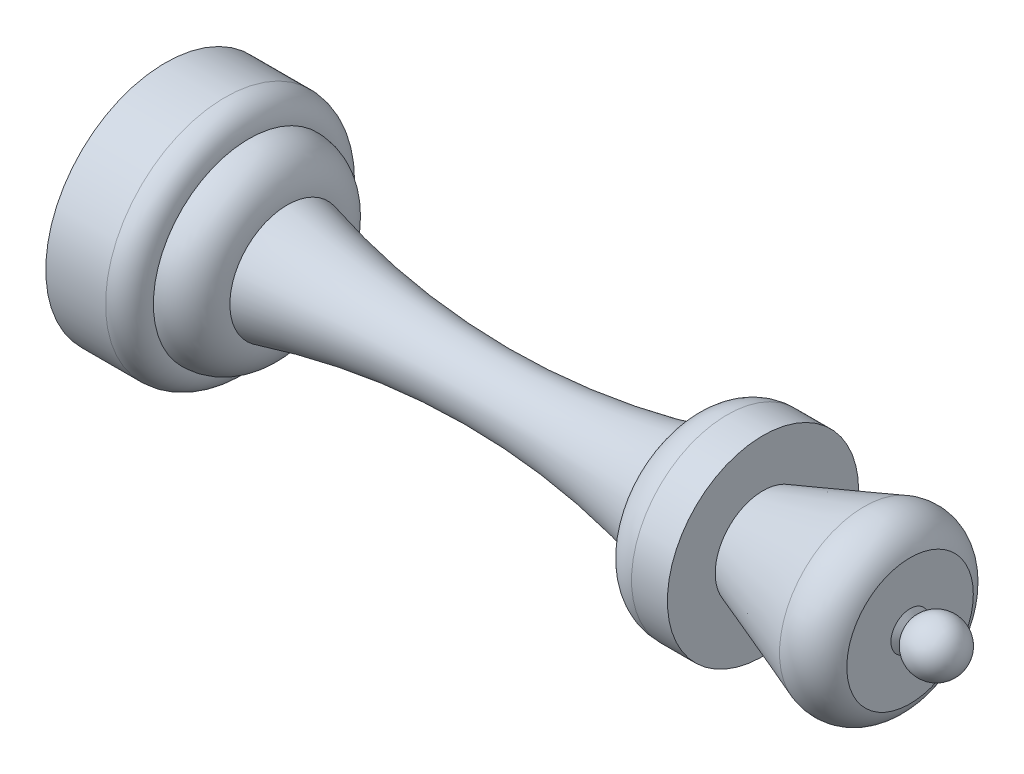
ISO-10303-21;
HEADER;
FILE_DESCRIPTION(('STEP AP214'),'2;1');
FILE_NAME('part.step','',(''),(''),'','','');
FILE_SCHEMA(('AUTOMOTIVE_DESIGN { 1 0 10303 214 1 1 1 1 }'));
ENDSEC;
DATA;
#1=APPLICATION_CONTEXT('core data for automotive mechanical design processes');
#2=APPLICATION_PROTOCOL_DEFINITION('international standard','automotive_design',2000,#1);
#3=PRODUCT_CONTEXT('',#1,'mechanical');
#4=PRODUCT('Part','Part','',(#3));
#5=PRODUCT_RELATED_PRODUCT_CATEGORY('part','',(#4));
#6=PRODUCT_DEFINITION_FORMATION('','',#4);
#7=PRODUCT_DEFINITION_CONTEXT('part definition',#1,'design');
#8=PRODUCT_DEFINITION('design','',#6,#7);
#9=PRODUCT_DEFINITION_SHAPE('','',#8);
#10=(LENGTH_UNIT() NAMED_UNIT(*) SI_UNIT(.MILLI.,.METRE.));
#11=(NAMED_UNIT(*) PLANE_ANGLE_UNIT() SI_UNIT($,.RADIAN.));
#12=(NAMED_UNIT(*) SI_UNIT($,.STERADIAN.) SOLID_ANGLE_UNIT());
#13=UNCERTAINTY_MEASURE_WITH_UNIT(LENGTH_MEASURE(1.E-05),#10,'distance_accuracy_value','');
#14=(GEOMETRIC_REPRESENTATION_CONTEXT(3) GLOBAL_UNCERTAINTY_ASSIGNED_CONTEXT((#13)) GLOBAL_UNIT_ASSIGNED_CONTEXT((#10,
#11,#12)) REPRESENTATION_CONTEXT('',''));
#15=CARTESIAN_POINT('',(0.,0.,0.));
#16=DIRECTION('',(0.,0.,1.));
#17=DIRECTION('',(1.,0.,0.));
#18=AXIS2_PLACEMENT_3D('',#15,#16,#17);
#19=CARTESIAN_POINT('',(7.,0.,0.));
#20=DIRECTION('',(1.,0.,0.));
#21=DIRECTION('',(0.,0.,-1.));
#22=AXIS2_PLACEMENT_3D('',#19,#20,#21);
#23=TOROIDAL_SURFACE('',#22,4.8,3.2);
#24=CARTESIAN_POINT('',(10.2,0.,0.));
#25=DIRECTION('',(1.,0.,0.));
#26=DIRECTION('',(0.,0.,-1.));
#27=AXIS2_PLACEMENT_3D('',#24,#25,#26);
#28=CIRCLE('',#27,4.8);
#29=CARTESIAN_POINT('',(10.2,0.,-4.8));
#30=VERTEX_POINT('',#29);
#31=EDGE_CURVE('E55',#30,#30,#28,.T.);
#32=ORIENTED_EDGE('',*,*,#31,.F.);
#33=EDGE_LOOP('',(#32));
#34=FACE_BOUND('',#33,.T.);
#35=CARTESIAN_POINT('',(7.,0.,0.));
#36=DIRECTION('',(1.,0.,0.));
#37=DIRECTION('',(0.,0.,-1.));
#38=AXIS2_PLACEMENT_3D('',#35,#36,#37);
#39=CIRCLE('',#38,8.);
#40=CARTESIAN_POINT('',(7.,0.,-8.));
#41=VERTEX_POINT('',#40);
#42=EDGE_CURVE('E60',#41,#41,#39,.T.);
#43=ORIENTED_EDGE('',*,*,#42,.T.);
#44=EDGE_LOOP('',(#43));
#45=FACE_BOUND('',#44,.T.);
#46=ADVANCED_FACE('F46',(#34,#45),#23,.T.);
#47=CARTESIAN_POINT('',(5.,0.,0.));
#48=DIRECTION('',(1.,0.,0.));
#49=DIRECTION('',(0.,0.,-1.));
#50=AXIS2_PLACEMENT_3D('',#47,#48,#49);
#51=TOROIDAL_SURFACE('',#50,8.,2.);
#52=ORIENTED_EDGE('',*,*,#42,.F.);
#53=EDGE_LOOP('',(#52));
#54=FACE_BOUND('',#53,.T.);
#55=CARTESIAN_POINT('',(5.,0.,0.));
#56=DIRECTION('',(1.,0.,0.));
#57=DIRECTION('',(0.,0.,-1.));
#58=AXIS2_PLACEMENT_3D('',#55,#56,#57);
#59=CIRCLE('',#58,10.);
#60=CARTESIAN_POINT('',(5.,0.,-10.));
#61=VERTEX_POINT('',#60);
#62=EDGE_CURVE('E65',#61,#61,#59,.T.);
#63=ORIENTED_EDGE('',*,*,#62,.T.);
#64=EDGE_LOOP('',(#63));
#65=FACE_BOUND('',#64,.T.);
#66=ADVANCED_FACE('F156',(#54,#65),#51,.T.);
#67=CARTESIAN_POINT('',(5.,0.,0.));
#68=DIRECTION('',(1.,0.,0.));
#69=DIRECTION('',(0.,0.,-1.));
#70=AXIS2_PLACEMENT_3D('',#67,#68,#69);
#71=CYLINDRICAL_SURFACE('',#70,10.);
#72=ORIENTED_EDGE('',*,*,#62,.F.);
#73=EDGE_LOOP('',(#72));
#74=FACE_BOUND('',#73,.T.);
#75=CARTESIAN_POINT('',(0.,0.,0.));
#76=DIRECTION('',(1.,0.,0.));
#77=DIRECTION('',(0.,0.,-1.));
#78=AXIS2_PLACEMENT_3D('',#75,#76,#77);
#79=CIRCLE('',#78,10.);
#80=CARTESIAN_POINT('',(0.,0.,-10.));
#81=VERTEX_POINT('',#80);
#82=EDGE_CURVE('E71',#81,#81,#79,.T.);
#83=ORIENTED_EDGE('',*,*,#82,.T.);
#84=EDGE_LOOP('',(#83));
#85=FACE_BOUND('',#84,.T.);
#86=ADVANCED_FACE('F162',(#74,#85),#71,.T.);
#87=CARTESIAN_POINT('',(0.,0.,0.));
#88=DIRECTION('',(1.,0.,0.));
#89=DIRECTION('',(0.,0.,-1.));
#90=AXIS2_PLACEMENT_3D('',#87,#88,#89);
#91=PLANE('',#90);
#92=ORIENTED_EDGE('',*,*,#82,.F.);
#93=EDGE_LOOP('',(#92));
#94=FACE_BOUND('',#93,.T.);
#95=ADVANCED_FACE('F118',(#94),#91,.F.);
#96=CARTESIAN_POINT('',(59.4832940170502,0.,0.));
#97=DIRECTION('',(1.,0.,0.));
#98=DIRECTION('',(0.,0.,-1.));
#99=AXIS2_PLACEMENT_3D('',#96,#97,#98);
#100=TOROIDAL_SURFACE('',#99,4.25910342757333,3.);
#101=CARTESIAN_POINT('',(62.3,0.,0.));
#102=DIRECTION('',(1.,0.,0.));
#103=DIRECTION('',(0.,0.,-1.));
#104=AXIS2_PLACEMENT_3D('',#101,#102,#103);
#105=CIRCLE('',#104,5.29165725455507);
#106=CARTESIAN_POINT('',(62.3,0.,-5.29165725455507));
#107=VERTEX_POINT('',#106);
#108=EDGE_CURVE('E107',#107,#107,#105,.T.);
#109=ORIENTED_EDGE('',*,*,#108,.F.);
#110=EDGE_LOOP('',(#109));
#111=FACE_BOUND('',#110,.T.);
#112=CARTESIAN_POINT('',(58.4572335870732,0.,0.));
#113=DIRECTION('',(1.,0.,0.));
#114=DIRECTION('',(0.,0.,-1.));
#115=AXIS2_PLACEMENT_3D('',#112,#113,#114);
#116=CIRCLE('',#115,7.07818128993106);
#117=CARTESIAN_POINT('',(58.4572335870732,0.,-7.07818128993106));
#118=VERTEX_POINT('',#117);
#119=EDGE_CURVE('E79',#118,#118,#116,.T.);
#120=ORIENTED_EDGE('',*,*,#119,.T.);
#121=EDGE_LOOP('',(#120));
#122=FACE_BOUND('',#121,.T.);
#123=ADVANCED_FACE('F114',(#111,#122),#100,.T.);
#124=CARTESIAN_POINT('',(50.,0.,0.));
#125=DIRECTION('',(1.,0.,0.));
#126=DIRECTION('',(0.,0.,-1.));
#127=AXIS2_PLACEMENT_3D('',#124,#125,#126);
#128=CONICAL_SURFACE('',#127,4.,0.34906585039887);
#129=ORIENTED_EDGE('',*,*,#119,.F.);
#130=EDGE_LOOP('',(#129));
#131=FACE_BOUND('',#130,.T.);
#132=CARTESIAN_POINT('',(50.,0.,0.));
#133=DIRECTION('',(1.,0.,0.));
#134=DIRECTION('',(0.,0.,-1.));
#135=AXIS2_PLACEMENT_3D('',#132,#133,#134);
#136=CIRCLE('',#135,4.);
#137=CARTESIAN_POINT('',(50.,0.,-4.));
#138=VERTEX_POINT('',#137);
#139=EDGE_CURVE('E83',#138,#138,#136,.T.);
#140=ORIENTED_EDGE('',*,*,#139,.T.);
#141=EDGE_LOOP('',(#140));
#142=FACE_BOUND('',#141,.T.);
#143=ADVANCED_FACE('F117',(#131,#142),#128,.T.);
#144=CARTESIAN_POINT('',(50.,0.,0.));
#145=DIRECTION('',(-1.,0.,0.));
#146=DIRECTION('',(0.,0.,1.));
#147=AXIS2_PLACEMENT_3D('',#144,#145,#146);
#148=PLANE('',#147);
#149=ORIENTED_EDGE('',*,*,#139,.F.);
#150=EDGE_LOOP('',(#149));
#151=FACE_BOUND('',#150,.T.);
#152=CARTESIAN_POINT('',(50.,0.,0.));
#153=DIRECTION('',(1.,0.,0.));
#154=DIRECTION('',(0.,0.,-1.));
#155=AXIS2_PLACEMENT_3D('',#152,#153,#154);
#156=CIRCLE('',#155,8.);
#157=CARTESIAN_POINT('',(50.,0.,-8.));
#158=VERTEX_POINT('',#157);
#159=EDGE_CURVE('E87',#158,#158,#156,.T.);
#160=ORIENTED_EDGE('',*,*,#159,.T.);
#161=EDGE_LOOP('',(#160));
#162=FACE_BOUND('',#161,.T.);
#163=ADVANCED_FACE('F124',(#151,#162),#148,.F.);
#164=CARTESIAN_POINT('',(50.,0.,0.));
#165=DIRECTION('',(1.,0.,0.));
#166=DIRECTION('',(0.,0.,-1.));
#167=AXIS2_PLACEMENT_3D('',#164,#165,#166);
#168=CYLINDRICAL_SURFACE('',#167,8.);
#169=ORIENTED_EDGE('',*,*,#159,.F.);
#170=EDGE_LOOP('',(#169));
#171=FACE_BOUND('',#170,.T.);
#172=CARTESIAN_POINT('',(47.,0.,0.));
#173=DIRECTION('',(1.,0.,0.));
#174=DIRECTION('',(0.,0.,-1.));
#175=AXIS2_PLACEMENT_3D('',#172,#173,#174);
#176=CIRCLE('',#175,8.);
#177=CARTESIAN_POINT('',(47.,0.,-8.));
#178=VERTEX_POINT('',#177);
#179=EDGE_CURVE('E91',#178,#178,#176,.T.);
#180=ORIENTED_EDGE('',*,*,#179,.T.);
#181=EDGE_LOOP('',(#180));
#182=FACE_BOUND('',#181,.T.);
#183=ADVANCED_FACE('F130',(#171,#182),#168,.T.);
#184=CARTESIAN_POINT('',(47.,0.,0.));
#185=DIRECTION('',(1.,0.,0.));
#186=DIRECTION('',(0.,0.,-1.));
#187=AXIS2_PLACEMENT_3D('',#184,#185,#186);
#188=TOROIDAL_SURFACE('',#187,4.8,3.2);
#189=ORIENTED_EDGE('',*,*,#179,.F.);
#190=EDGE_LOOP('',(#189));
#191=FACE_BOUND('',#190,.T.);
#192=CARTESIAN_POINT('',(43.8,0.,0.));
#193=DIRECTION('',(1.,0.,0.));
#194=DIRECTION('',(0.,0.,-1.));
#195=AXIS2_PLACEMENT_3D('',#192,#193,#194);
#196=CIRCLE('',#195,4.8);
#197=CARTESIAN_POINT('',(43.8,0.,-4.8));
#198=VERTEX_POINT('',#197);
#199=EDGE_CURVE('E95',#198,#198,#196,.T.);
#200=ORIENTED_EDGE('',*,*,#199,.T.);
#201=EDGE_LOOP('',(#200));
#202=FACE_BOUND('',#201,.T.);
#203=ADVANCED_FACE('F136',(#191,#202),#188,.T.);
#204=CARTESIAN_POINT('',(27.,0.,0.));
#205=DIRECTION('',(1.,0.,0.));
#206=DIRECTION('',(0.,0.,-1.));
#207=AXIS2_PLACEMENT_3D('',#204,#205,#206);
#208=TOROIDAL_SURFACE('',#207,67.5914006851257,65.);
#209=ORIENTED_EDGE('',*,*,#199,.F.);
#210=EDGE_LOOP('',(#209));
#211=FACE_BOUND('',#210,.T.);
#212=ORIENTED_EDGE('',*,*,#31,.T.);
#213=EDGE_LOOP('',(#212));
#214=FACE_BOUND('',#213,.T.);
#215=ADVANCED_FACE('F142',(#211,#214),#208,.F.);
#216=CARTESIAN_POINT('',(64.5,0.,0.));
#217=DIRECTION('',(1.,0.,0.));
#218=DIRECTION('',(0.,0.,-1.));
#219=AXIS2_PLACEMENT_3D('',#216,#217,#218);
#220=SPHERICAL_SURFACE('',#219,2.19999999999999);
#221=CARTESIAN_POINT('',(62.5947441116742,0.,0.));
#222=DIRECTION('',(1.,0.,0.));
#223=DIRECTION('',(0.,0.,-1.));
#224=AXIS2_PLACEMENT_3D('',#221,#222,#223);
#225=CIRCLE('',#224,1.09999999999999);
#226=CARTESIAN_POINT('',(62.5947441116742,0.,-1.09999999999999));
#227=VERTEX_POINT('',#226);
#228=EDGE_CURVE('E99',#227,#227,#225,.T.);
#229=ORIENTED_EDGE('',*,*,#228,.T.);
#230=EDGE_LOOP('',(#229));
#231=FACE_BOUND('',#230,.T.);
#232=ADVANCED_FACE('F147',(#231),#220,.T.);
#233=CARTESIAN_POINT('',(62.3,0.,0.));
#234=DIRECTION('',(-1.,0.,0.));
#235=DIRECTION('',(0.,0.,1.));
#236=AXIS2_PLACEMENT_3D('',#233,#234,#235);
#237=CONICAL_SURFACE('',#236,1.60000000000001,1.03814192975492);
#238=ORIENTED_EDGE('',*,*,#228,.F.);
#239=EDGE_LOOP('',(#238));
#240=FACE_BOUND('',#239,.T.);
#241=CARTESIAN_POINT('',(62.3,0.,0.));
#242=DIRECTION('',(1.,0.,0.));
#243=DIRECTION('',(0.,0.,-1.));
#244=AXIS2_PLACEMENT_3D('',#241,#242,#243);
#245=CIRCLE('',#244,1.60000000000001);
#246=CARTESIAN_POINT('',(62.3,0.,-1.60000000000001));
#247=VERTEX_POINT('',#246);
#248=EDGE_CURVE('E103',#247,#247,#245,.T.);
#249=ORIENTED_EDGE('',*,*,#248,.T.);
#250=EDGE_LOOP('',(#249));
#251=FACE_BOUND('',#250,.T.);
#252=ADVANCED_FACE('F152',(#240,#251),#237,.T.);
#253=CARTESIAN_POINT('',(62.3,0.,0.));
#254=DIRECTION('',(-1.,0.,0.));
#255=DIRECTION('',(0.,0.,1.));
#256=AXIS2_PLACEMENT_3D('',#253,#254,#255);
#257=PLANE('',#256);
#258=ORIENTED_EDGE('',*,*,#248,.F.);
#259=EDGE_LOOP('',(#258));
#260=FACE_BOUND('',#259,.T.);
#261=ORIENTED_EDGE('',*,*,#108,.T.);
#262=EDGE_LOOP('',(#261));
#263=FACE_BOUND('',#262,.T.);
#264=ADVANCED_FACE('F112',(#260,#263),#257,.F.);
#265=CLOSED_SHELL('',(#46,#66,#86,#95,#123,#143,#163,#183,#203,#215,#232,#252,#264));
#266=CARTESIAN_POINT('',(5.,0.,0.));
#267=DIRECTION('',(1.,0.,0.));
#268=DIRECTION('',(0.,0.,-1.));
#269=AXIS2_PLACEMENT_3D('',#266,#267,#268);
#270=CYLINDRICAL_SURFACE('',#269,5.25);
#271=CARTESIAN_POINT('',(3.5,0.,0.));
#272=DIRECTION('',(1.,0.,0.));
#273=DIRECTION('',(0.,0.,-1.));
#274=AXIS2_PLACEMENT_3D('',#271,#272,#273);
#275=CIRCLE('',#274,5.25);
#276=CARTESIAN_POINT('',(3.5,0.,-5.25));
#277=VERTEX_POINT('',#276);
#278=EDGE_CURVE('E10',#277,#277,#275,.T.);
#279=ORIENTED_EDGE('',*,*,#278,.T.);
#280=EDGE_LOOP('',(#279));
#281=FACE_BOUND('',#280,.T.);
#282=CARTESIAN_POINT('',(1.,0.,0.));
#283=DIRECTION('',(1.,0.,0.));
#284=DIRECTION('',(0.,0.,-1.));
#285=AXIS2_PLACEMENT_3D('',#282,#283,#284);
#286=CIRCLE('',#285,5.25);
#287=CARTESIAN_POINT('',(1.,0.,-5.25));
#288=VERTEX_POINT('',#287);
#289=EDGE_CURVE('E75',#288,#288,#286,.T.);
#290=ORIENTED_EDGE('',*,*,#289,.F.);
#291=EDGE_LOOP('',(#290));
#292=FACE_BOUND('',#291,.T.);
#293=ADVANCED_FACE('F48',(#281,#292),#270,.F.);
#294=CARTESIAN_POINT('',(3.5,0.,0.));
#295=DIRECTION('',(-1.,0.,0.));
#296=DIRECTION('',(0.,0.,1.));
#297=AXIS2_PLACEMENT_3D('',#294,#295,#296);
#298=PLANE('',#297);
#299=ORIENTED_EDGE('',*,*,#278,.F.);
#300=EDGE_LOOP('',(#299));
#301=FACE_BOUND('',#300,.T.);
#302=ADVANCED_FACE('F167',(#301),#298,.T.);
#303=CARTESIAN_POINT('',(1.,0.,0.));
#304=DIRECTION('',(1.,0.,0.));
#305=DIRECTION('',(0.,0.,-1.));
#306=AXIS2_PLACEMENT_3D('',#303,#304,#305);
#307=PLANE('',#306);
#308=ORIENTED_EDGE('',*,*,#289,.T.);
#309=EDGE_LOOP('',(#308));
#310=FACE_BOUND('',#309,.T.);
#311=ADVANCED_FACE('F169',(#310),#307,.T.);
#312=CLOSED_SHELL('',(#293,#302,#311));
#313=ORIENTED_CLOSED_SHELL('',*,#312,.T.);
#314=BREP_WITH_VOIDS('B2',#265,(#313));
#315=ADVANCED_BREP_SHAPE_REPRESENTATION('',(#18,#314),#14);
#316=SHAPE_DEFINITION_REPRESENTATION(#9,#315);
ENDSEC;
END-ISO-10303-21;
